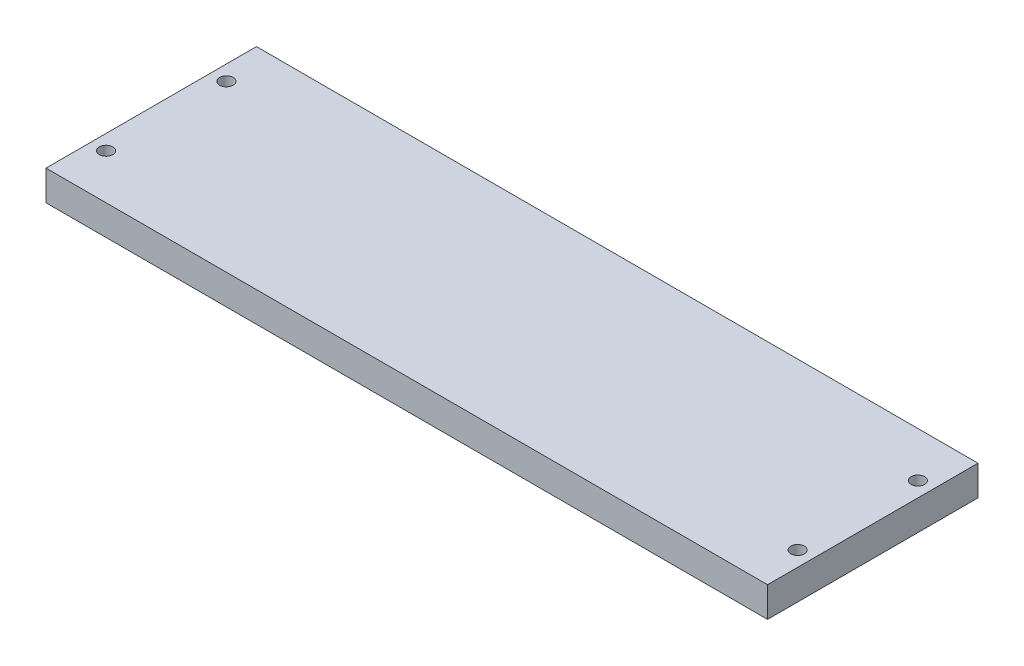
ISO-10303-21;
HEADER;
FILE_DESCRIPTION(('STEP AP214'),'2;1');
FILE_NAME('part.step','',(''),(''),'','','');
FILE_SCHEMA(('AUTOMOTIVE_DESIGN { 1 0 10303 214 1 1 1 1 }'));
ENDSEC;
DATA;
#1=APPLICATION_CONTEXT('core data for automotive mechanical design processes');
#2=APPLICATION_PROTOCOL_DEFINITION('international standard','automotive_design',2000,#1);
#3=PRODUCT_CONTEXT('',#1,'mechanical');
#4=PRODUCT('Part','Part','',(#3));
#5=PRODUCT_RELATED_PRODUCT_CATEGORY('part','',(#4));
#6=PRODUCT_DEFINITION_FORMATION('','',#4);
#7=PRODUCT_DEFINITION_CONTEXT('part definition',#1,'design');
#8=PRODUCT_DEFINITION('design','',#6,#7);
#9=PRODUCT_DEFINITION_SHAPE('','',#8);
#10=(LENGTH_UNIT() NAMED_UNIT(*) SI_UNIT(.MILLI.,.METRE.));
#11=(NAMED_UNIT(*) PLANE_ANGLE_UNIT() SI_UNIT($,.RADIAN.));
#12=(NAMED_UNIT(*) SI_UNIT($,.STERADIAN.) SOLID_ANGLE_UNIT());
#13=UNCERTAINTY_MEASURE_WITH_UNIT(LENGTH_MEASURE(1.E-05),#10,'distance_accuracy_value','');
#14=(GEOMETRIC_REPRESENTATION_CONTEXT(3) GLOBAL_UNCERTAINTY_ASSIGNED_CONTEXT((#13)) GLOBAL_UNIT_ASSIGNED_CONTEXT((#10,
#11,#12)) REPRESENTATION_CONTEXT('',''));
#15=CARTESIAN_POINT('',(0.,0.,0.));
#16=DIRECTION('',(0.,0.,1.));
#17=DIRECTION('',(1.,0.,0.));
#18=AXIS2_PLACEMENT_3D('',#15,#16,#17);
#19=CARTESIAN_POINT('',(120.,5.,35.));
#20=DIRECTION('',(-1.,0.,0.));
#21=DIRECTION('',(0.,0.,1.));
#22=AXIS2_PLACEMENT_3D('',#19,#20,#21);
#23=PLANE('',#22);
#24=DIRECTION('',(0.,0.,-1.));
#25=VECTOR('',#24,1.);
#26=CARTESIAN_POINT('',(120.,-5.,35.));
#27=LINE('',#26,#25);
#28=CARTESIAN_POINT('',(120.,-5.,35.));
#29=VERTEX_POINT('',#28);
#30=CARTESIAN_POINT('',(120.,-5.,-35.));
#31=VERTEX_POINT('',#30);
#32=EDGE_CURVE('E102',#29,#31,#27,.T.);
#33=ORIENTED_EDGE('',*,*,#32,.T.);
#34=DIRECTION('',(0.,-1.,0.));
#35=VECTOR('',#34,1.);
#36=CARTESIAN_POINT('',(120.,5.,-35.));
#37=LINE('',#36,#35);
#38=CARTESIAN_POINT('',(120.,5.,-35.));
#39=VERTEX_POINT('',#38);
#40=EDGE_CURVE('E11',#39,#31,#37,.T.);
#41=ORIENTED_EDGE('',*,*,#40,.F.);
#42=DIRECTION('',(0.,0.,-1.));
#43=VECTOR('',#42,1.);
#44=CARTESIAN_POINT('',(120.,5.,35.));
#45=LINE('',#44,#43);
#46=CARTESIAN_POINT('',(120.,5.,35.));
#47=VERTEX_POINT('',#46);
#48=EDGE_CURVE('E90',#47,#39,#45,.T.);
#49=ORIENTED_EDGE('',*,*,#48,.F.);
#50=DIRECTION('',(0.,-1.,0.));
#51=VECTOR('',#50,1.);
#52=CARTESIAN_POINT('',(120.,5.,35.));
#53=LINE('',#52,#51);
#54=EDGE_CURVE('E98',#47,#29,#53,.T.);
#55=ORIENTED_EDGE('',*,*,#54,.T.);
#56=EDGE_LOOP('',(#33,#41,#49,#55));
#57=FACE_BOUND('',#56,.T.);
#58=ADVANCED_FACE('F39',(#57),#23,.F.);
#59=CARTESIAN_POINT('',(-120.,5.,-35.));
#60=DIRECTION('',(0.,0.,1.));
#61=DIRECTION('',(1.,0.,0.));
#62=AXIS2_PLACEMENT_3D('',#59,#60,#61);
#63=PLANE('',#62);
#64=DIRECTION('',(-1.,0.,0.));
#65=VECTOR('',#64,1.);
#66=CARTESIAN_POINT('',(-120.,-5.,-35.));
#67=LINE('',#66,#65);
#68=CARTESIAN_POINT('',(-120.,-5.,-35.));
#69=VERTEX_POINT('',#68);
#70=EDGE_CURVE('E94',#31,#69,#67,.T.);
#71=ORIENTED_EDGE('',*,*,#70,.T.);
#72=DIRECTION('',(0.,-1.,0.));
#73=VECTOR('',#72,1.);
#74=CARTESIAN_POINT('',(-120.,5.,-35.));
#75=LINE('',#74,#73);
#76=CARTESIAN_POINT('',(-120.,5.,-35.));
#77=VERTEX_POINT('',#76);
#78=EDGE_CURVE('E47',#77,#69,#75,.T.);
#79=ORIENTED_EDGE('',*,*,#78,.F.);
#80=DIRECTION('',(-1.,0.,0.));
#81=VECTOR('',#80,1.);
#82=CARTESIAN_POINT('',(-120.,5.,-35.));
#83=LINE('',#82,#81);
#84=EDGE_CURVE('E85',#39,#77,#83,.T.);
#85=ORIENTED_EDGE('',*,*,#84,.F.);
#86=ORIENTED_EDGE('',*,*,#40,.T.);
#87=EDGE_LOOP('',(#71,#79,#85,#86));
#88=FACE_BOUND('',#87,.T.);
#89=ADVANCED_FACE('F93',(#88),#63,.F.);
#90=CARTESIAN_POINT('',(-120.,5.,35.));
#91=DIRECTION('',(1.,0.,0.));
#92=DIRECTION('',(0.,0.,-1.));
#93=AXIS2_PLACEMENT_3D('',#90,#91,#92);
#94=PLANE('',#93);
#95=DIRECTION('',(0.,0.,1.));
#96=VECTOR('',#95,1.);
#97=CARTESIAN_POINT('',(-120.,-5.,35.));
#98=LINE('',#97,#96);
#99=CARTESIAN_POINT('',(-120.,-5.,35.));
#100=VERTEX_POINT('',#99);
#101=EDGE_CURVE('E72',#69,#100,#98,.T.);
#102=ORIENTED_EDGE('',*,*,#101,.T.);
#103=DIRECTION('',(0.,-1.,0.));
#104=VECTOR('',#103,1.);
#105=CARTESIAN_POINT('',(-120.,5.,35.));
#106=LINE('',#105,#104);
#107=CARTESIAN_POINT('',(-120.,5.,35.));
#108=VERTEX_POINT('',#107);
#109=EDGE_CURVE('E95',#108,#100,#106,.T.);
#110=ORIENTED_EDGE('',*,*,#109,.F.);
#111=DIRECTION('',(0.,0.,1.));
#112=VECTOR('',#111,1.);
#113=CARTESIAN_POINT('',(-120.,5.,35.));
#114=LINE('',#113,#112);
#115=EDGE_CURVE('E88',#77,#108,#114,.T.);
#116=ORIENTED_EDGE('',*,*,#115,.F.);
#117=ORIENTED_EDGE('',*,*,#78,.T.);
#118=EDGE_LOOP('',(#102,#110,#116,#117));
#119=FACE_BOUND('',#118,.T.);
#120=ADVANCED_FACE('F96',(#119),#94,.F.);
#121=CARTESIAN_POINT('',(-120.,5.,35.));
#122=DIRECTION('',(0.,0.,-1.));
#123=DIRECTION('',(-1.,0.,0.));
#124=AXIS2_PLACEMENT_3D('',#121,#122,#123);
#125=PLANE('',#124);
#126=DIRECTION('',(1.,0.,0.));
#127=VECTOR('',#126,1.);
#128=CARTESIAN_POINT('',(-120.,-5.,35.));
#129=LINE('',#128,#127);
#130=EDGE_CURVE('E78',#100,#29,#129,.T.);
#131=ORIENTED_EDGE('',*,*,#130,.T.);
#132=ORIENTED_EDGE('',*,*,#54,.F.);
#133=DIRECTION('',(1.,0.,0.));
#134=VECTOR('',#133,1.);
#135=CARTESIAN_POINT('',(-120.,5.,35.));
#136=LINE('',#135,#134);
#137=EDGE_CURVE('E55',#108,#47,#136,.T.);
#138=ORIENTED_EDGE('',*,*,#137,.F.);
#139=ORIENTED_EDGE('',*,*,#109,.T.);
#140=EDGE_LOOP('',(#131,#132,#138,#139));
#141=FACE_BOUND('',#140,.T.);
#142=ADVANCED_FACE('F110',(#141),#125,.F.);
#143=CARTESIAN_POINT('',(0.,5.,0.));
#144=DIRECTION('',(0.,-1.,0.));
#145=DIRECTION('',(0.,0.,-1.));
#146=AXIS2_PLACEMENT_3D('',#143,#144,#145);
#147=PLANE('',#146);
#148=CARTESIAN_POINT('',(115.,5.,-20.));
#149=DIRECTION('',(0.,1.,0.));
#150=DIRECTION('',(0.,0.,-1.));
#151=AXIS2_PLACEMENT_3D('',#148,#149,#150);
#152=CIRCLE('',#151,2.25);
#153=CARTESIAN_POINT('',(115.,5.,-22.25));
#154=VERTEX_POINT('',#153);
#155=EDGE_CURVE('E125',#154,#154,#152,.T.);
#156=ORIENTED_EDGE('',*,*,#155,.F.);
#157=EDGE_LOOP('',(#156));
#158=FACE_BOUND('',#157,.T.);
#159=CARTESIAN_POINT('',(115.,5.,20.));
#160=DIRECTION('',(0.,1.,0.));
#161=DIRECTION('',(0.,0.,-1.));
#162=AXIS2_PLACEMENT_3D('',#159,#160,#161);
#163=CIRCLE('',#162,2.25);
#164=CARTESIAN_POINT('',(115.,5.,17.75));
#165=VERTEX_POINT('',#164);
#166=EDGE_CURVE('E131',#165,#165,#163,.T.);
#167=ORIENTED_EDGE('',*,*,#166,.F.);
#168=EDGE_LOOP('',(#167));
#169=FACE_BOUND('',#168,.T.);
#170=CARTESIAN_POINT('',(-115.,5.,20.));
#171=DIRECTION('',(0.,1.,0.));
#172=DIRECTION('',(0.,0.,1.));
#173=AXIS2_PLACEMENT_3D('',#170,#171,#172);
#174=CIRCLE('',#173,2.25);
#175=CARTESIAN_POINT('',(-115.,5.,22.25));
#176=VERTEX_POINT('',#175);
#177=EDGE_CURVE('E119',#176,#176,#174,.T.);
#178=ORIENTED_EDGE('',*,*,#177,.F.);
#179=EDGE_LOOP('',(#178));
#180=FACE_BOUND('',#179,.T.);
#181=CARTESIAN_POINT('',(-115.,5.,-20.));
#182=DIRECTION('',(0.,1.,0.));
#183=DIRECTION('',(0.,0.,1.));
#184=AXIS2_PLACEMENT_3D('',#181,#182,#183);
#185=CIRCLE('',#184,2.25);
#186=CARTESIAN_POINT('',(-115.,5.,-17.75));
#187=VERTEX_POINT('',#186);
#188=EDGE_CURVE('E116',#187,#187,#185,.T.);
#189=ORIENTED_EDGE('',*,*,#188,.F.);
#190=EDGE_LOOP('',(#189));
#191=FACE_BOUND('',#190,.T.);
#192=ORIENTED_EDGE('',*,*,#48,.T.);
#193=ORIENTED_EDGE('',*,*,#84,.T.);
#194=ORIENTED_EDGE('',*,*,#115,.T.);
#195=ORIENTED_EDGE('',*,*,#137,.T.);
#196=EDGE_LOOP('',(#192,#193,#194,#195));
#197=FACE_BOUND('',#196,.T.);
#198=ADVANCED_FACE('F86',(#158,#169,#180,#191,#197),#147,.F.);
#199=CARTESIAN_POINT('',(0.,-5.,0.));
#200=DIRECTION('',(0.,-1.,0.));
#201=DIRECTION('',(0.,0.,-1.));
#202=AXIS2_PLACEMENT_3D('',#199,#200,#201);
#203=PLANE('',#202);
#204=CARTESIAN_POINT('',(115.,-5.,-20.));
#205=DIRECTION('',(0.,1.,0.));
#206=DIRECTION('',(0.,0.,-1.));
#207=AXIS2_PLACEMENT_3D('',#204,#205,#206);
#208=CIRCLE('',#207,2.25);
#209=CARTESIAN_POINT('',(115.,-5.,-22.25));
#210=VERTEX_POINT('',#209);
#211=EDGE_CURVE('E122',#210,#210,#208,.T.);
#212=ORIENTED_EDGE('',*,*,#211,.T.);
#213=EDGE_LOOP('',(#212));
#214=FACE_BOUND('',#213,.T.);
#215=CARTESIAN_POINT('',(115.,-5.,20.));
#216=DIRECTION('',(0.,1.,0.));
#217=DIRECTION('',(0.,0.,-1.));
#218=AXIS2_PLACEMENT_3D('',#215,#216,#217);
#219=CIRCLE('',#218,2.25);
#220=CARTESIAN_POINT('',(115.,-5.,17.75));
#221=VERTEX_POINT('',#220);
#222=EDGE_CURVE('E128',#221,#221,#219,.T.);
#223=ORIENTED_EDGE('',*,*,#222,.T.);
#224=EDGE_LOOP('',(#223));
#225=FACE_BOUND('',#224,.T.);
#226=CARTESIAN_POINT('',(-115.,-5.,20.));
#227=DIRECTION('',(0.,1.,0.));
#228=DIRECTION('',(0.,0.,1.));
#229=AXIS2_PLACEMENT_3D('',#226,#227,#228);
#230=CIRCLE('',#229,2.25);
#231=CARTESIAN_POINT('',(-115.,-5.,22.25));
#232=VERTEX_POINT('',#231);
#233=EDGE_CURVE('E134',#232,#232,#230,.T.);
#234=ORIENTED_EDGE('',*,*,#233,.T.);
#235=EDGE_LOOP('',(#234));
#236=FACE_BOUND('',#235,.T.);
#237=CARTESIAN_POINT('',(-115.,-5.,-20.));
#238=DIRECTION('',(0.,1.,0.));
#239=DIRECTION('',(0.,0.,1.));
#240=AXIS2_PLACEMENT_3D('',#237,#238,#239);
#241=CIRCLE('',#240,2.25);
#242=CARTESIAN_POINT('',(-115.,-5.,-17.75));
#243=VERTEX_POINT('',#242);
#244=EDGE_CURVE('E105',#243,#243,#241,.T.);
#245=ORIENTED_EDGE('',*,*,#244,.T.);
#246=EDGE_LOOP('',(#245));
#247=FACE_BOUND('',#246,.T.);
#248=ORIENTED_EDGE('',*,*,#32,.F.);
#249=ORIENTED_EDGE('',*,*,#130,.F.);
#250=ORIENTED_EDGE('',*,*,#101,.F.);
#251=ORIENTED_EDGE('',*,*,#70,.F.);
#252=EDGE_LOOP('',(#248,#249,#250,#251));
#253=FACE_BOUND('',#252,.T.);
#254=ADVANCED_FACE('F113',(#214,#225,#236,#247,#253),#203,.T.);
#255=CARTESIAN_POINT('',(-115.,-5.,-20.));
#256=DIRECTION('',(0.,1.,0.));
#257=DIRECTION('',(0.,0.,1.));
#258=AXIS2_PLACEMENT_3D('',#255,#256,#257);
#259=CYLINDRICAL_SURFACE('',#258,2.25);
#260=ORIENTED_EDGE('',*,*,#244,.F.);
#261=EDGE_LOOP('',(#260));
#262=FACE_BOUND('',#261,.T.);
#263=ORIENTED_EDGE('',*,*,#188,.T.);
#264=EDGE_LOOP('',(#263));
#265=FACE_BOUND('',#264,.T.);
#266=ADVANCED_FACE('F148',(#262,#265),#259,.F.);
#267=CARTESIAN_POINT('',(-115.,-5.,20.));
#268=DIRECTION('',(0.,1.,0.));
#269=DIRECTION('',(0.,0.,1.));
#270=AXIS2_PLACEMENT_3D('',#267,#268,#269);
#271=CYLINDRICAL_SURFACE('',#270,2.25);
#272=ORIENTED_EDGE('',*,*,#233,.F.);
#273=EDGE_LOOP('',(#272));
#274=FACE_BOUND('',#273,.T.);
#275=ORIENTED_EDGE('',*,*,#177,.T.);
#276=EDGE_LOOP('',(#275));
#277=FACE_BOUND('',#276,.T.);
#278=ADVANCED_FACE('F140',(#274,#277),#271,.F.);
#279=CARTESIAN_POINT('',(115.,-5.,20.));
#280=DIRECTION('',(0.,1.,0.));
#281=DIRECTION('',(0.,0.,1.));
#282=AXIS2_PLACEMENT_3D('',#279,#280,#281);
#283=CYLINDRICAL_SURFACE('',#282,2.25);
#284=ORIENTED_EDGE('',*,*,#222,.F.);
#285=EDGE_LOOP('',(#284));
#286=FACE_BOUND('',#285,.T.);
#287=ORIENTED_EDGE('',*,*,#166,.T.);
#288=EDGE_LOOP('',(#287));
#289=FACE_BOUND('',#288,.T.);
#290=ADVANCED_FACE('F156',(#286,#289),#283,.F.);
#291=CARTESIAN_POINT('',(115.,-5.,-20.));
#292=DIRECTION('',(0.,1.,0.));
#293=DIRECTION('',(0.,0.,1.));
#294=AXIS2_PLACEMENT_3D('',#291,#292,#293);
#295=CYLINDRICAL_SURFACE('',#294,2.25);
#296=ORIENTED_EDGE('',*,*,#211,.F.);
#297=EDGE_LOOP('',(#296));
#298=FACE_BOUND('',#297,.T.);
#299=ORIENTED_EDGE('',*,*,#155,.T.);
#300=EDGE_LOOP('',(#299));
#301=FACE_BOUND('',#300,.T.);
#302=ADVANCED_FACE('F207',(#298,#301),#295,.F.);
#303=CLOSED_SHELL('',(#58,#89,#120,#142,#198,#254,#266,#278,#290,#302));
#304=MANIFOLD_SOLID_BREP('B2',#303);
#305=ADVANCED_BREP_SHAPE_REPRESENTATION('',(#18,#304),#14);
#306=SHAPE_DEFINITION_REPRESENTATION(#9,#305);
ENDSEC;
END-ISO-10303-21;
